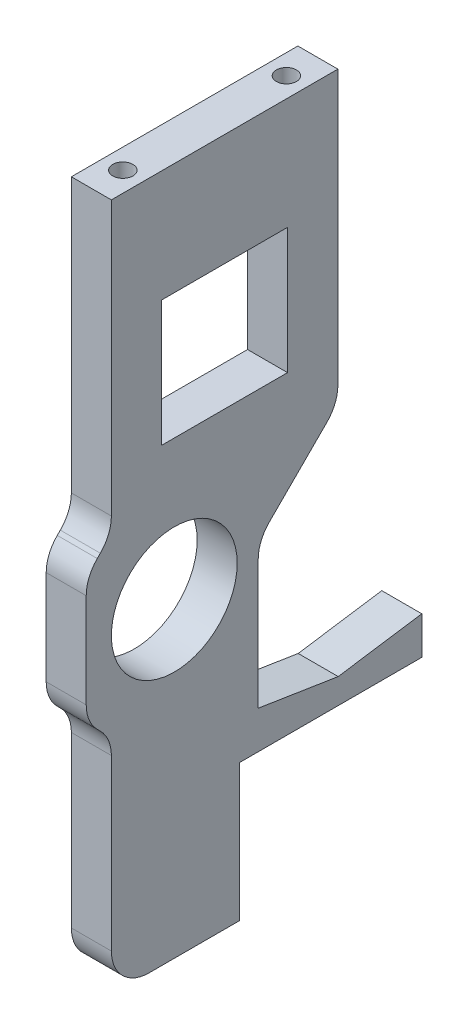
ISO-10303-21;
HEADER;
FILE_DESCRIPTION(('STEP AP214'),'2;1');
FILE_NAME('part.step','',(''),(''),'','','');
FILE_SCHEMA(('AUTOMOTIVE_DESIGN { 1 0 10303 214 1 1 1 1 }'));
ENDSEC;
DATA;
#1=APPLICATION_CONTEXT('core data for automotive mechanical design processes');
#2=APPLICATION_PROTOCOL_DEFINITION('international standard','automotive_design',2000,#1);
#3=PRODUCT_CONTEXT('',#1,'mechanical');
#4=PRODUCT('Part','Part','',(#3));
#5=PRODUCT_RELATED_PRODUCT_CATEGORY('part','',(#4));
#6=PRODUCT_DEFINITION_FORMATION('','',#4);
#7=PRODUCT_DEFINITION_CONTEXT('part definition',#1,'design');
#8=PRODUCT_DEFINITION('design','',#6,#7);
#9=PRODUCT_DEFINITION_SHAPE('','',#8);
#10=(LENGTH_UNIT() NAMED_UNIT(*) SI_UNIT(.MILLI.,.METRE.));
#11=(NAMED_UNIT(*) PLANE_ANGLE_UNIT() SI_UNIT($,.RADIAN.));
#12=(NAMED_UNIT(*) SI_UNIT($,.STERADIAN.) SOLID_ANGLE_UNIT());
#13=UNCERTAINTY_MEASURE_WITH_UNIT(LENGTH_MEASURE(1.E-05),#10,'distance_accuracy_value','');
#14=(GEOMETRIC_REPRESENTATION_CONTEXT(3) GLOBAL_UNCERTAINTY_ASSIGNED_CONTEXT((#13)) GLOBAL_UNIT_ASSIGNED_CONTEXT((#10,
#11,#12)) REPRESENTATION_CONTEXT('',''));
#15=CARTESIAN_POINT('',(0.,0.,0.));
#16=DIRECTION('',(0.,0.,1.));
#17=DIRECTION('',(1.,0.,0.));
#18=AXIS2_PLACEMENT_3D('',#15,#16,#17);
#19=CARTESIAN_POINT('',(3.18,-3.58642812516907,7.39959254020485));
#20=DIRECTION('',(0.,0.,-1.));
#21=DIRECTION('',(0.,1.,0.));
#22=AXIS2_PLACEMENT_3D('',#19,#20,#21);
#23=PLANE('',#22);
#24=DIRECTION('',(0.,1.,0.));
#25=VECTOR('',#24,1.);
#26=CARTESIAN_POINT('',(3.18,-3.58642812516907,7.39959254020485));
#27=LINE('',#26,#25);
#28=CARTESIAN_POINT('',(3.18,-2.34378743804977,7.39959254020485));
#29=VERTEX_POINT('',#28);
#30=CARTESIAN_POINT('',(3.18,19.4135718748309,7.39959254020485));
#31=VERTEX_POINT('',#30);
#32=EDGE_CURVE('E273',#29,#31,#27,.T.);
#33=ORIENTED_EDGE('',*,*,#32,.T.);
#34=DIRECTION('',(-1.,0.,0.));
#35=VECTOR('',#34,1.);
#36=CARTESIAN_POINT('',(3.18,19.4135718748309,7.39959254020485));
#37=LINE('',#36,#35);
#38=CARTESIAN_POINT('',(0.,19.4135718748309,7.39959254020485));
#39=VERTEX_POINT('',#38);
#40=EDGE_CURVE('E379',#31,#39,#37,.T.);
#41=ORIENTED_EDGE('',*,*,#40,.T.);
#42=DIRECTION('',(0.,1.,0.));
#43=VECTOR('',#42,1.);
#44=CARTESIAN_POINT('',(0.,-3.58642812516907,7.39959254020485));
#45=LINE('',#44,#43);
#46=CARTESIAN_POINT('',(0.,-2.34378743804977,7.39959254020485));
#47=VERTEX_POINT('',#46);
#48=EDGE_CURVE('E270',#47,#39,#45,.T.);
#49=ORIENTED_EDGE('',*,*,#48,.F.);
#50=DIRECTION('',(-1.,0.,0.));
#51=VECTOR('',#50,1.);
#52=CARTESIAN_POINT('',(0.,-2.34378743804977,7.39959254020485));
#53=LINE('',#52,#51);
#54=EDGE_CURVE('E433',#29,#47,#53,.T.);
#55=ORIENTED_EDGE('',*,*,#54,.F.);
#56=EDGE_LOOP('',(#33,#41,#49,#55));
#57=FACE_BOUND('',#56,.T.);
#58=ADVANCED_FACE('F36',(#57),#23,.F.);
#59=CARTESIAN_POINT('',(3.18,19.4135718748309,7.39959254020485));
#60=DIRECTION('',(0.,-1.,0.));
#61=DIRECTION('',(0.,0.,-1.));
#62=AXIS2_PLACEMENT_3D('',#59,#60,#61);
#63=PLANE('',#62);
#64=CARTESIAN_POINT('',(1.59,19.4135718748309,4.89959254020485));
#65=DIRECTION('',(0.,-1.,0.));
#66=DIRECTION('',(0.,0.,1.));
#67=AXIS2_PLACEMENT_3D('',#64,#65,#66);
#68=CIRCLE('',#67,0.8);
#69=CARTESIAN_POINT('',(1.59,19.4135718748309,5.69959254020485));
#70=VERTEX_POINT('',#69);
#71=EDGE_CURVE('E254',#70,#70,#68,.T.);
#72=ORIENTED_EDGE('',*,*,#71,.T.);
#73=EDGE_LOOP('',(#72));
#74=FACE_BOUND('',#73,.T.);
#75=CARTESIAN_POINT('',(1.59,19.4135718748309,-8.1004074597951));
#76=DIRECTION('',(0.,-1.,0.));
#77=DIRECTION('',(0.,0.,1.));
#78=AXIS2_PLACEMENT_3D('',#75,#76,#77);
#79=CIRCLE('',#78,0.8);
#80=CARTESIAN_POINT('',(1.59,19.4135718748309,-7.3004074597951));
#81=VERTEX_POINT('',#80);
#82=EDGE_CURVE('E260',#81,#81,#79,.T.);
#83=ORIENTED_EDGE('',*,*,#82,.T.);
#84=EDGE_LOOP('',(#83));
#85=FACE_BOUND('',#84,.T.);
#86=DIRECTION('',(0.,0.,-1.));
#87=VECTOR('',#86,1.);
#88=CARTESIAN_POINT('',(0.,19.4135718748309,7.39959254020485));
#89=LINE('',#88,#87);
#90=CARTESIAN_POINT('',(0.,19.4135718748309,-10.6004074597951));
#91=VERTEX_POINT('',#90);
#92=EDGE_CURVE('E320',#39,#91,#89,.T.);
#93=ORIENTED_EDGE('',*,*,#92,.F.);
#94=ORIENTED_EDGE('',*,*,#40,.F.);
#95=DIRECTION('',(0.,0.,-1.));
#96=VECTOR('',#95,1.);
#97=CARTESIAN_POINT('',(3.18,19.4135718748309,7.39959254020485));
#98=LINE('',#97,#96);
#99=CARTESIAN_POINT('',(3.18,19.4135718748309,-10.6004074597951));
#100=VERTEX_POINT('',#99);
#101=EDGE_CURVE('E276',#31,#100,#98,.T.);
#102=ORIENTED_EDGE('',*,*,#101,.T.);
#103=DIRECTION('',(-1.,0.,0.));
#104=VECTOR('',#103,1.);
#105=CARTESIAN_POINT('',(3.18,19.4135718748309,-10.6004074597951));
#106=LINE('',#105,#104);
#107=EDGE_CURVE('E376',#100,#91,#106,.T.);
#108=ORIENTED_EDGE('',*,*,#107,.T.);
#109=EDGE_LOOP('',(#93,#94,#102,#108));
#110=FACE_BOUND('',#109,.T.);
#111=ADVANCED_FACE('F520',(#74,#85,#110),#63,.F.);
#112=CARTESIAN_POINT('',(3.18,19.4135718748309,-10.6004074597951));
#113=DIRECTION('',(0.,0.,1.));
#114=DIRECTION('',(0.,-1.,0.));
#115=AXIS2_PLACEMENT_3D('',#112,#113,#114);
#116=PLANE('',#115);
#117=DIRECTION('',(0.,-1.,0.));
#118=VECTOR('',#117,1.);
#119=CARTESIAN_POINT('',(0.,19.4135718748309,-10.6004074597951));
#120=LINE('',#119,#118);
#121=CARTESIAN_POINT('',(0.,-2.34378743804976,-10.6004074597951));
#122=VERTEX_POINT('',#121);
#123=EDGE_CURVE('E323',#91,#122,#120,.T.);
#124=ORIENTED_EDGE('',*,*,#123,.F.);
#125=ORIENTED_EDGE('',*,*,#107,.F.);
#126=DIRECTION('',(0.,-1.,0.));
#127=VECTOR('',#126,1.);
#128=CARTESIAN_POINT('',(3.18,19.4135718748309,-10.6004074597951));
#129=LINE('',#128,#127);
#130=CARTESIAN_POINT('',(3.18,-2.34378743804976,-10.6004074597951));
#131=VERTEX_POINT('',#130);
#132=EDGE_CURVE('E280',#100,#131,#129,.T.);
#133=ORIENTED_EDGE('',*,*,#132,.T.);
#134=DIRECTION('',(-1.,0.,0.));
#135=VECTOR('',#134,1.);
#136=CARTESIAN_POINT('',(3.18,-2.34378743804976,-10.6004074597951));
#137=LINE('',#136,#135);
#138=EDGE_CURVE('E396',#122,#131,#137,.F.);
#139=ORIENTED_EDGE('',*,*,#138,.F.);
#140=EDGE_LOOP('',(#124,#125,#133,#139));
#141=FACE_BOUND('',#140,.T.);
#142=ADVANCED_FACE('F523',(#141),#116,.F.);
#143=CARTESIAN_POINT('',(3.18,-3.58642812516907,-10.6004074597951));
#144=DIRECTION('',(0.,0.707106781186556,0.707106781186539));
#145=DIRECTION('',(0.,-0.707106781186539,0.707106781186556));
#146=AXIS2_PLACEMENT_3D('',#143,#144,#145);
#147=PLANE('',#146);
#148=DIRECTION('',(0.,-0.707106781186539,0.707106781186556));
#149=VECTOR('',#148,1.);
#150=CARTESIAN_POINT('',(3.18,-3.58642812516907,-10.6004074597951));
#151=LINE('',#150,#149);
#152=CARTESIAN_POINT('',(3.18,-4.46510778160943,-9.72172780335472));
#153=VERTEX_POINT('',#152);
#154=CARTESIAN_POINT('',(3.18,-9.03774846872851,-5.14908711623553));
#155=VERTEX_POINT('',#154);
#156=EDGE_CURVE('E283',#153,#155,#151,.T.);
#157=ORIENTED_EDGE('',*,*,#156,.T.);
#158=DIRECTION('',(-1.,0.,0.));
#159=VECTOR('',#158,1.);
#160=CARTESIAN_POINT('',(3.18,-9.03774846872851,-5.14908711623553));
#161=LINE('',#160,#159);
#162=CARTESIAN_POINT('',(0.,-9.03774846872851,-5.14908711623553));
#163=VERTEX_POINT('',#162);
#164=EDGE_CURVE('E382',#163,#155,#161,.F.);
#165=ORIENTED_EDGE('',*,*,#164,.F.);
#166=DIRECTION('',(0.,-0.707106781186539,0.707106781186556));
#167=VECTOR('',#166,1.);
#168=CARTESIAN_POINT('',(0.,-3.58642812516907,-10.6004074597951));
#169=LINE('',#168,#167);
#170=CARTESIAN_POINT('',(0.,-4.46510778160943,-9.72172780335472));
#171=VERTEX_POINT('',#170);
#172=EDGE_CURVE('E326',#171,#163,#169,.T.);
#173=ORIENTED_EDGE('',*,*,#172,.F.);
#174=DIRECTION('',(-1.,0.,0.));
#175=VECTOR('',#174,1.);
#176=CARTESIAN_POINT('',(3.18,-4.46510778160943,-9.72172780335472));
#177=LINE('',#176,#175);
#178=EDGE_CURVE('E385',#153,#171,#177,.T.);
#179=ORIENTED_EDGE('',*,*,#178,.F.);
#180=EDGE_LOOP('',(#157,#165,#173,#179));
#181=FACE_BOUND('',#180,.T.);
#182=ADVANCED_FACE('F454',(#181),#147,.F.);
#183=CARTESIAN_POINT('',(3.18,-9.91642812516887,-4.27040745979515));
#184=DIRECTION('',(0.,0.,1.));
#185=DIRECTION('',(0.,-1.,0.));
#186=AXIS2_PLACEMENT_3D('',#183,#184,#185);
#187=PLANE('',#186);
#188=DIRECTION('',(0.,-1.,0.));
#189=VECTOR('',#188,1.);
#190=CARTESIAN_POINT('',(3.18,-9.91642812516887,-4.27040745979515));
#191=LINE('',#190,#189);
#192=CARTESIAN_POINT('',(3.18,-11.1590688122882,-4.27040745979515));
#193=VERTEX_POINT('',#192);
#194=CARTESIAN_POINT('',(3.18,-21.406428125169,-4.27040745979516));
#195=VERTEX_POINT('',#194);
#196=EDGE_CURVE('E286',#193,#195,#191,.T.);
#197=ORIENTED_EDGE('',*,*,#196,.T.);
#198=DIRECTION('',(-1.,0.,0.));
#199=VECTOR('',#198,1.);
#200=CARTESIAN_POINT('',(3.18,-21.406428125169,-4.27040745979516));
#201=LINE('',#200,#199);
#202=CARTESIAN_POINT('',(0.,-21.406428125169,-4.27040745979516));
#203=VERTEX_POINT('',#202);
#204=EDGE_CURVE('E373',#195,#203,#201,.T.);
#205=ORIENTED_EDGE('',*,*,#204,.T.);
#206=DIRECTION('',(0.,-1.,0.));
#207=VECTOR('',#206,1.);
#208=CARTESIAN_POINT('',(0.,-9.91642812516887,-4.27040745979515));
#209=LINE('',#208,#207);
#210=CARTESIAN_POINT('',(0.,-11.1590688122882,-4.27040745979515));
#211=VERTEX_POINT('',#210);
#212=EDGE_CURVE('E329',#211,#203,#209,.T.);
#213=ORIENTED_EDGE('',*,*,#212,.F.);
#214=DIRECTION('',(-1.,0.,0.));
#215=VECTOR('',#214,1.);
#216=CARTESIAN_POINT('',(0.,-11.1590688122882,-4.27040745979515));
#217=LINE('',#216,#215);
#218=EDGE_CURVE('E436',#193,#211,#217,.T.);
#219=ORIENTED_EDGE('',*,*,#218,.F.);
#220=EDGE_LOOP('',(#197,#205,#213,#219));
#221=FACE_BOUND('',#220,.T.);
#222=ADVANCED_FACE('F458',(#221),#187,.F.);
#223=CARTESIAN_POINT('',(3.18,-21.406428125169,-4.27040745979516));
#224=DIRECTION('',(0.,-0.987844405197016,0.15544591059579));
#225=DIRECTION('',(0.,-0.15544591059579,-0.987844405197016));
#226=AXIS2_PLACEMENT_3D('',#223,#224,#225);
#227=PLANE('',#226);
#228=DIRECTION('',(0.,-0.15544591059579,-0.987844405197016));
#229=VECTOR('',#228,1.);
#230=CARTESIAN_POINT('',(0.,-21.406428125169,-4.27040745979516));
#231=LINE('',#230,#229);
#232=CARTESIAN_POINT('',(0.,-22.406428125169,-10.6253151020151));
#233=VERTEX_POINT('',#232);
#234=EDGE_CURVE('E332',#203,#233,#231,.T.);
#235=ORIENTED_EDGE('',*,*,#234,.F.);
#236=ORIENTED_EDGE('',*,*,#204,.F.);
#237=DIRECTION('',(0.,-0.15544591059579,-0.987844405197016));
#238=VECTOR('',#237,1.);
#239=CARTESIAN_POINT('',(3.18,-21.406428125169,-4.27040745979516));
#240=LINE('',#239,#238);
#241=CARTESIAN_POINT('',(3.18,-22.406428125169,-10.6253151020151));
#242=VERTEX_POINT('',#241);
#243=EDGE_CURVE('E289',#195,#242,#240,.T.);
#244=ORIENTED_EDGE('',*,*,#243,.T.);
#245=DIRECTION('',(-1.,0.,0.));
#246=VECTOR('',#245,1.);
#247=CARTESIAN_POINT('',(3.18,-22.406428125169,-10.6253151020151));
#248=LINE('',#247,#246);
#249=EDGE_CURVE('E370',#242,#233,#248,.T.);
#250=ORIENTED_EDGE('',*,*,#249,.T.);
#251=EDGE_LOOP('',(#235,#236,#244,#250));
#252=FACE_BOUND('',#251,.T.);
#253=ADVANCED_FACE('F461',(#252),#227,.F.);
#254=CARTESIAN_POINT('',(3.18,-22.406428125169,-10.6253151020151));
#255=DIRECTION('',(0.,-0.988865593942495,-0.148811414605055));
#256=DIRECTION('',(0.,0.148811414605055,-0.988865593942495));
#257=AXIS2_PLACEMENT_3D('',#254,#255,#256);
#258=PLANE('',#257);
#259=DIRECTION('',(0.,0.148811414605055,-0.988865593942494));
#260=VECTOR('',#259,1.);
#261=CARTESIAN_POINT('',(0.,-22.406428125169,-10.6253151020151));
#262=LINE('',#261,#260);
#263=CARTESIAN_POINT('',(0.,-21.406428125169,-17.2704074597952));
#264=VERTEX_POINT('',#263);
#265=EDGE_CURVE('E335',#233,#264,#262,.T.);
#266=ORIENTED_EDGE('',*,*,#265,.F.);
#267=ORIENTED_EDGE('',*,*,#249,.F.);
#268=DIRECTION('',(0.,0.148811414605055,-0.988865593942494));
#269=VECTOR('',#268,1.);
#270=CARTESIAN_POINT('',(3.18,-22.406428125169,-10.6253151020151));
#271=LINE('',#270,#269);
#272=CARTESIAN_POINT('',(3.18,-21.406428125169,-17.2704074597952));
#273=VERTEX_POINT('',#272);
#274=EDGE_CURVE('E292',#242,#273,#271,.T.);
#275=ORIENTED_EDGE('',*,*,#274,.T.);
#276=DIRECTION('',(-1.,0.,0.));
#277=VECTOR('',#276,1.);
#278=CARTESIAN_POINT('',(3.18,-21.406428125169,-17.2704074597952));
#279=LINE('',#278,#277);
#280=EDGE_CURVE('E367',#273,#264,#279,.T.);
#281=ORIENTED_EDGE('',*,*,#280,.T.);
#282=EDGE_LOOP('',(#266,#267,#275,#281));
#283=FACE_BOUND('',#282,.T.);
#284=ADVANCED_FACE('F464',(#283),#258,.F.);
#285=CARTESIAN_POINT('',(3.18,-21.406428125169,-17.2704074597952));
#286=DIRECTION('',(0.,0.,1.));
#287=DIRECTION('',(-1.,0.,0.));
#288=AXIS2_PLACEMENT_3D('',#285,#286,#287);
#289=PLANE('',#288);
#290=DIRECTION('',(0.,-1.,0.));
#291=VECTOR('',#290,1.);
#292=CARTESIAN_POINT('',(0.,-21.406428125169,-17.2704074597952));
#293=LINE('',#292,#291);
#294=CARTESIAN_POINT('',(0.,-24.406428125169,-17.2704074597952));
#295=VERTEX_POINT('',#294);
#296=EDGE_CURVE('E338',#264,#295,#293,.T.);
#297=ORIENTED_EDGE('',*,*,#296,.F.);
#298=ORIENTED_EDGE('',*,*,#280,.F.);
#299=DIRECTION('',(0.,-1.,0.));
#300=VECTOR('',#299,1.);
#301=CARTESIAN_POINT('',(3.18,-21.406428125169,-17.2704074597952));
#302=LINE('',#301,#300);
#303=CARTESIAN_POINT('',(3.18,-24.406428125169,-17.2704074597952));
#304=VERTEX_POINT('',#303);
#305=EDGE_CURVE('E295',#273,#304,#302,.T.);
#306=ORIENTED_EDGE('',*,*,#305,.T.);
#307=DIRECTION('',(-1.,0.,0.));
#308=VECTOR('',#307,1.);
#309=CARTESIAN_POINT('',(3.18,-24.406428125169,-17.2704074597952));
#310=LINE('',#309,#308);
#311=EDGE_CURVE('E364',#304,#295,#310,.T.);
#312=ORIENTED_EDGE('',*,*,#311,.T.);
#313=EDGE_LOOP('',(#297,#298,#306,#312));
#314=FACE_BOUND('',#313,.T.);
#315=ADVANCED_FACE('F467',(#314),#289,.F.);
#316=CARTESIAN_POINT('',(3.18,-24.406428125169,-2.77040745979515));
#317=DIRECTION('',(0.,-1.,0.));
#318=DIRECTION('',(0.,0.,-1.));
#319=AXIS2_PLACEMENT_3D('',#316,#317,#318);
#320=PLANE('',#319);
#321=DIRECTION('',(0.,0.,-1.));
#322=VECTOR('',#321,1.);
#323=CARTESIAN_POINT('',(0.,-24.406428125169,-2.77040745979515));
#324=LINE('',#323,#322);
#325=CARTESIAN_POINT('',(0.,-24.406428125169,-2.77040745979515));
#326=VERTEX_POINT('',#325);
#327=EDGE_CURVE('E341',#326,#295,#324,.T.);
#328=ORIENTED_EDGE('',*,*,#327,.T.);
#329=ORIENTED_EDGE('',*,*,#311,.F.);
#330=DIRECTION('',(0.,0.,-1.));
#331=VECTOR('',#330,1.);
#332=CARTESIAN_POINT('',(3.18,-24.406428125169,-2.77040745979515));
#333=LINE('',#332,#331);
#334=CARTESIAN_POINT('',(3.18,-24.406428125169,-2.77040745979515));
#335=VERTEX_POINT('',#334);
#336=EDGE_CURVE('E298',#335,#304,#333,.T.);
#337=ORIENTED_EDGE('',*,*,#336,.F.);
#338=DIRECTION('',(-1.,0.,0.));
#339=VECTOR('',#338,1.);
#340=CARTESIAN_POINT('',(3.18,-24.406428125169,-2.77040745979515));
#341=LINE('',#340,#339);
#342=EDGE_CURVE('E361',#335,#326,#341,.T.);
#343=ORIENTED_EDGE('',*,*,#342,.T.);
#344=EDGE_LOOP('',(#328,#329,#337,#343));
#345=FACE_BOUND('',#344,.T.);
#346=ADVANCED_FACE('F472',(#345),#320,.T.);
#347=CARTESIAN_POINT('',(3.18,-35.286428125169,-2.77040745979516));
#348=DIRECTION('',(0.,0.,-1.));
#349=DIRECTION('',(0.,1.,0.));
#350=AXIS2_PLACEMENT_3D('',#347,#348,#349);
#351=PLANE('',#350);
#352=DIRECTION('',(0.,1.,0.));
#353=VECTOR('',#352,1.);
#354=CARTESIAN_POINT('',(0.,-35.286428125169,-2.77040745979516));
#355=LINE('',#354,#353);
#356=CARTESIAN_POINT('',(0.,-35.286428125169,-2.77040745979516));
#357=VERTEX_POINT('',#356);
#358=EDGE_CURVE('E343',#357,#326,#355,.T.);
#359=ORIENTED_EDGE('',*,*,#358,.T.);
#360=ORIENTED_EDGE('',*,*,#342,.F.);
#361=DIRECTION('',(0.,1.,0.));
#362=VECTOR('',#361,1.);
#363=CARTESIAN_POINT('',(3.18,-35.286428125169,-2.77040745979516));
#364=LINE('',#363,#362);
#365=CARTESIAN_POINT('',(3.18,-35.286428125169,-2.77040745979516));
#366=VERTEX_POINT('',#365);
#367=EDGE_CURVE('E300',#366,#335,#364,.T.);
#368=ORIENTED_EDGE('',*,*,#367,.F.);
#369=DIRECTION('',(-1.,0.,0.));
#370=VECTOR('',#369,1.);
#371=CARTESIAN_POINT('',(3.18,-35.286428125169,-2.77040745979516));
#372=LINE('',#371,#370);
#373=EDGE_CURVE('E317',#366,#357,#372,.T.);
#374=ORIENTED_EDGE('',*,*,#373,.T.);
#375=EDGE_LOOP('',(#359,#360,#368,#374));
#376=FACE_BOUND('',#375,.T.);
#377=ADVANCED_FACE('F477',(#376),#351,.T.);
#378=CARTESIAN_POINT('',(3.18,-35.286428125169,-2.77040745979516));
#379=DIRECTION('',(0.,1.,0.));
#380=DIRECTION('',(0.,0.,1.));
#381=AXIS2_PLACEMENT_3D('',#378,#379,#380);
#382=PLANE('',#381);
#383=DIRECTION('',(0.,0.,1.));
#384=VECTOR('',#383,1.);
#385=CARTESIAN_POINT('',(0.,-35.286428125169,-2.77040745979516));
#386=LINE('',#385,#384);
#387=CARTESIAN_POINT('',(0.,-35.286428125169,4.39959254020484));
#388=VERTEX_POINT('',#387);
#389=EDGE_CURVE('E345',#357,#388,#386,.T.);
#390=ORIENTED_EDGE('',*,*,#389,.F.);
#391=ORIENTED_EDGE('',*,*,#373,.F.);
#392=DIRECTION('',(0.,0.,1.));
#393=VECTOR('',#392,1.);
#394=CARTESIAN_POINT('',(3.18,-35.286428125169,-2.77040745979516));
#395=LINE('',#394,#393);
#396=CARTESIAN_POINT('',(3.18,-35.286428125169,4.39959254020484));
#397=VERTEX_POINT('',#396);
#398=EDGE_CURVE('E302',#366,#397,#395,.T.);
#399=ORIENTED_EDGE('',*,*,#398,.T.);
#400=DIRECTION('',(-1.,0.,0.));
#401=VECTOR('',#400,1.);
#402=CARTESIAN_POINT('',(3.18,-35.286428125169,4.39959254020484));
#403=LINE('',#402,#401);
#404=EDGE_CURVE('E413',#388,#397,#403,.F.);
#405=ORIENTED_EDGE('',*,*,#404,.F.);
#406=EDGE_LOOP('',(#390,#391,#399,#405));
#407=FACE_BOUND('',#406,.T.);
#408=ADVANCED_FACE('F480',(#407),#382,.F.);
#409=CARTESIAN_POINT('',(3.18,-17.586428125169,7.39959254020485));
#410=DIRECTION('',(0.,0.,1.));
#411=DIRECTION('',(0.,-1.,0.));
#412=AXIS2_PLACEMENT_3D('',#409,#410,#411);
#413=PLANE('',#412);
#414=DIRECTION('',(0.,-1.,0.));
#415=VECTOR('',#414,1.);
#416=CARTESIAN_POINT('',(3.18,-17.586428125169,7.39959254020485));
#417=LINE('',#416,#415);
#418=CARTESIAN_POINT('',(3.18,-18.8290688122883,7.39959254020485));
#419=VERTEX_POINT('',#418);
#420=CARTESIAN_POINT('',(3.18,-32.286428125169,7.39959254020484));
#421=VERTEX_POINT('',#420);
#422=EDGE_CURVE('E305',#419,#421,#417,.T.);
#423=ORIENTED_EDGE('',*,*,#422,.F.);
#424=DIRECTION('',(-1.,0.,0.));
#425=VECTOR('',#424,1.);
#426=CARTESIAN_POINT('',(3.18,-18.8290688122883,7.39959254020485));
#427=LINE('',#426,#425);
#428=CARTESIAN_POINT('',(0.,-18.8290688122883,7.39959254020485));
#429=VERTEX_POINT('',#428);
#430=EDGE_CURVE('E407',#429,#419,#427,.F.);
#431=ORIENTED_EDGE('',*,*,#430,.F.);
#432=DIRECTION('',(0.,-1.,0.));
#433=VECTOR('',#432,1.);
#434=CARTESIAN_POINT('',(0.,-17.586428125169,7.39959254020485));
#435=LINE('',#434,#433);
#436=CARTESIAN_POINT('',(0.,-32.286428125169,7.39959254020484));
#437=VERTEX_POINT('',#436);
#438=EDGE_CURVE('E348',#429,#437,#435,.T.);
#439=ORIENTED_EDGE('',*,*,#438,.T.);
#440=DIRECTION('',(-1.,0.,0.));
#441=VECTOR('',#440,1.);
#442=CARTESIAN_POINT('',(0.,-32.286428125169,7.39959254020484));
#443=LINE('',#442,#441);
#444=EDGE_CURVE('E410',#421,#437,#443,.T.);
#445=ORIENTED_EDGE('',*,*,#444,.F.);
#446=EDGE_LOOP('',(#423,#431,#439,#445));
#447=FACE_BOUND('',#446,.T.);
#448=ADVANCED_FACE('F489',(#447),#413,.T.);
#449=CARTESIAN_POINT('',(3.18,-15.586428125169,9.39959254020484));
#450=DIRECTION('',(0.,-0.707106781186556,0.707106781186539));
#451=DIRECTION('',(0.,-0.707106781186539,-0.707106781186556));
#452=AXIS2_PLACEMENT_3D('',#449,#450,#451);
#453=PLANE('',#452);
#454=DIRECTION('',(0.,-0.707106781186539,-0.707106781186556));
#455=VECTOR('',#454,1.);
#456=CARTESIAN_POINT('',(3.18,-15.586428125169,9.39959254020484));
#457=LINE('',#456,#455);
#458=CARTESIAN_POINT('',(3.18,-16.4651077816094,8.52091288376447));
#459=VERTEX_POINT('',#458);
#460=CARTESIAN_POINT('',(3.18,-16.7077484687286,8.27827219664523));
#461=VERTEX_POINT('',#460);
#462=EDGE_CURVE('E308',#459,#461,#457,.T.);
#463=ORIENTED_EDGE('',*,*,#462,.F.);
#464=DIRECTION('',(-1.,0.,0.));
#465=VECTOR('',#464,1.);
#466=CARTESIAN_POINT('',(3.18,-16.4651077816094,8.52091288376446));
#467=LINE('',#466,#465);
#468=CARTESIAN_POINT('',(0.,-16.4651077816094,8.52091288376447));
#469=VERTEX_POINT('',#468);
#470=EDGE_CURVE('E416',#469,#459,#467,.F.);
#471=ORIENTED_EDGE('',*,*,#470,.F.);
#472=DIRECTION('',(0.,-0.707106781186539,-0.707106781186556));
#473=VECTOR('',#472,1.);
#474=CARTESIAN_POINT('',(0.,-15.586428125169,9.39959254020484));
#475=LINE('',#474,#473);
#476=CARTESIAN_POINT('',(0.,-16.7077484687286,8.27827219664523));
#477=VERTEX_POINT('',#476);
#478=EDGE_CURVE('E351',#469,#477,#475,.T.);
#479=ORIENTED_EDGE('',*,*,#478,.T.);
#480=DIRECTION('',(-1.,0.,0.));
#481=VECTOR('',#480,1.);
#482=CARTESIAN_POINT('',(0.,-16.7077484687286,8.27827219664523));
#483=LINE('',#482,#481);
#484=EDGE_CURVE('E419',#461,#477,#483,.T.);
#485=ORIENTED_EDGE('',*,*,#484,.F.);
#486=EDGE_LOOP('',(#463,#471,#479,#485));
#487=FACE_BOUND('',#486,.T.);
#488=ADVANCED_FACE('F497',(#487),#453,.T.);
#489=CARTESIAN_POINT('',(3.18,-15.586428125169,9.39959254020484));
#490=DIRECTION('',(0.,0.,-1.));
#491=DIRECTION('',(1.,0.,0.));
#492=AXIS2_PLACEMENT_3D('',#489,#490,#491);
#493=PLANE('',#492);
#494=DIRECTION('',(0.,1.,0.));
#495=VECTOR('',#494,1.);
#496=CARTESIAN_POINT('',(3.18,-15.586428125169,9.39959254020484));
#497=LINE('',#496,#495);
#498=CARTESIAN_POINT('',(3.18,-14.3437874380497,9.39959254020484));
#499=VERTEX_POINT('',#498);
#500=CARTESIAN_POINT('',(3.18,-6.82906881228833,9.39959254020484));
#501=VERTEX_POINT('',#500);
#502=EDGE_CURVE('E311',#499,#501,#497,.T.);
#503=ORIENTED_EDGE('',*,*,#502,.T.);
#504=DIRECTION('',(-1.,0.,0.));
#505=VECTOR('',#504,1.);
#506=CARTESIAN_POINT('',(3.18,-6.82906881228833,9.39959254020484));
#507=LINE('',#506,#505);
#508=CARTESIAN_POINT('',(0.,-6.82906881228833,9.39959254020484));
#509=VERTEX_POINT('',#508);
#510=EDGE_CURVE('E422',#509,#501,#507,.F.);
#511=ORIENTED_EDGE('',*,*,#510,.F.);
#512=DIRECTION('',(0.,1.,0.));
#513=VECTOR('',#512,1.);
#514=CARTESIAN_POINT('',(0.,-15.586428125169,9.39959254020484));
#515=LINE('',#514,#513);
#516=CARTESIAN_POINT('',(0.,-14.3437874380497,9.39959254020484));
#517=VERTEX_POINT('',#516);
#518=EDGE_CURVE('E354',#517,#509,#515,.T.);
#519=ORIENTED_EDGE('',*,*,#518,.F.);
#520=DIRECTION('',(-1.,0.,0.));
#521=VECTOR('',#520,1.);
#522=CARTESIAN_POINT('',(0.,-14.3437874380497,9.39959254020484));
#523=LINE('',#522,#521);
#524=EDGE_CURVE('E425',#499,#517,#523,.T.);
#525=ORIENTED_EDGE('',*,*,#524,.F.);
#526=EDGE_LOOP('',(#503,#511,#519,#525));
#527=FACE_BOUND('',#526,.T.);
#528=ADVANCED_FACE('F505',(#527),#493,.F.);
#529=CARTESIAN_POINT('',(3.18,-5.58642812516902,9.39959254020484));
#530=DIRECTION('',(0.,-0.707106781186555,-0.70710678118654));
#531=DIRECTION('',(0.,0.70710678118654,-0.707106781186555));
#532=AXIS2_PLACEMENT_3D('',#529,#530,#531);
#533=PLANE('',#532);
#534=DIRECTION('',(0.,0.70710678118654,-0.707106781186555));
#535=VECTOR('',#534,1.);
#536=CARTESIAN_POINT('',(3.18,-5.58642812516902,9.39959254020484));
#537=LINE('',#536,#535);
#538=CARTESIAN_POINT('',(3.18,-4.70774846872866,8.52091288376447));
#539=VERTEX_POINT('',#538);
#540=CARTESIAN_POINT('',(3.18,-4.46510778160943,8.27827219664523));
#541=VERTEX_POINT('',#540);
#542=EDGE_CURVE('E314',#539,#541,#537,.T.);
#543=ORIENTED_EDGE('',*,*,#542,.T.);
#544=DIRECTION('',(-1.,0.,0.));
#545=VECTOR('',#544,1.);
#546=CARTESIAN_POINT('',(3.18,-4.46510778160943,8.27827219664523));
#547=LINE('',#546,#545);
#548=CARTESIAN_POINT('',(0.,-4.46510778160943,8.27827219664523));
#549=VERTEX_POINT('',#548);
#550=EDGE_CURVE('E428',#549,#541,#547,.F.);
#551=ORIENTED_EDGE('',*,*,#550,.F.);
#552=DIRECTION('',(0.,0.70710678118654,-0.707106781186555));
#553=VECTOR('',#552,1.);
#554=CARTESIAN_POINT('',(0.,-5.58642812516902,9.39959254020484));
#555=LINE('',#554,#553);
#556=CARTESIAN_POINT('',(0.,-4.70774846872866,8.52091288376447));
#557=VERTEX_POINT('',#556);
#558=EDGE_CURVE('E277',#557,#549,#555,.T.);
#559=ORIENTED_EDGE('',*,*,#558,.F.);
#560=DIRECTION('',(-1.,0.,0.));
#561=VECTOR('',#560,1.);
#562=CARTESIAN_POINT('',(3.18,-4.70774846872866,8.52091288376447));
#563=LINE('',#562,#561);
#564=EDGE_CURVE('E430',#539,#557,#563,.T.);
#565=ORIENTED_EDGE('',*,*,#564,.F.);
#566=EDGE_LOOP('',(#543,#551,#559,#565));
#567=FACE_BOUND('',#566,.T.);
#568=ADVANCED_FACE('F512',(#567),#533,.F.);
#569=CARTESIAN_POINT('',(3.18,0.,0.));
#570=DIRECTION('',(1.,0.,0.));
#571=DIRECTION('',(0.,0.,1.));
#572=AXIS2_PLACEMENT_3D('',#569,#570,#571);
#573=PLANE('',#572);
#574=DIRECTION('',(0.,0.,-1.));
#575=VECTOR('',#574,1.);
#576=CARTESIAN_POINT('',(3.18,0.524437773348046,-6.6004074597951));
#577=LINE('',#576,#575);
#578=CARTESIAN_POINT('',(3.18,0.524437773348046,3.39959254020491));
#579=VERTEX_POINT('',#578);
#580=CARTESIAN_POINT('',(3.18,0.524437773348046,-6.6004074597951));
#581=VERTEX_POINT('',#580);
#582=EDGE_CURVE('E233',#579,#581,#577,.T.);
#583=ORIENTED_EDGE('',*,*,#582,.F.);
#584=DIRECTION('',(0.,-1.,0.));
#585=VECTOR('',#584,1.);
#586=CARTESIAN_POINT('',(3.18,10.5244377733481,3.39959254020491));
#587=LINE('',#586,#585);
#588=CARTESIAN_POINT('',(3.18,10.5244377733481,3.39959254020491));
#589=VERTEX_POINT('',#588);
#590=EDGE_CURVE('E238',#589,#579,#587,.T.);
#591=ORIENTED_EDGE('',*,*,#590,.F.);
#592=DIRECTION('',(0.,0.,1.));
#593=VECTOR('',#592,1.);
#594=CARTESIAN_POINT('',(3.18,10.5244377733481,-6.6004074597951));
#595=LINE('',#594,#593);
#596=CARTESIAN_POINT('',(3.18,10.5244377733481,-6.6004074597951));
#597=VERTEX_POINT('',#596);
#598=EDGE_CURVE('E226',#597,#589,#595,.T.);
#599=ORIENTED_EDGE('',*,*,#598,.F.);
#600=DIRECTION('',(0.,1.,0.));
#601=VECTOR('',#600,1.);
#602=CARTESIAN_POINT('',(3.18,10.5244377733481,-6.6004074597951));
#603=LINE('',#602,#601);
#604=EDGE_CURVE('E216',#581,#597,#603,.T.);
#605=ORIENTED_EDGE('',*,*,#604,.F.);
#606=EDGE_LOOP('',(#583,#591,#599,#605));
#607=FACE_BOUND('',#606,.T.);
#608=CARTESIAN_POINT('',(3.18,-10.586428125169,2.39959254020484));
#609=DIRECTION('',(1.,0.,0.));
#610=DIRECTION('',(0.,0.,-1.));
#611=AXIS2_PLACEMENT_3D('',#608,#609,#610);
#612=CIRCLE('',#611,5.);
#613=CARTESIAN_POINT('',(3.18,-10.586428125169,-2.60040745979516));
#614=VERTEX_POINT('',#613);
#615=EDGE_CURVE('E267',#614,#614,#612,.T.);
#616=ORIENTED_EDGE('',*,*,#615,.F.);
#617=EDGE_LOOP('',(#616));
#618=FACE_BOUND('',#617,.T.);
#619=ORIENTED_EDGE('',*,*,#132,.F.);
#620=ORIENTED_EDGE('',*,*,#101,.F.);
#621=ORIENTED_EDGE('',*,*,#32,.F.);
#622=CARTESIAN_POINT('',(3.18,-2.34378743804977,10.3995925402048));
#623=DIRECTION('',(-1.,0.,0.));
#624=DIRECTION('',(0.,0.,1.));
#625=AXIS2_PLACEMENT_3D('',#622,#623,#624);
#626=CIRCLE('',#625,3.);
#627=EDGE_CURVE('E59',#541,#29,#626,.F.);
#628=ORIENTED_EDGE('',*,*,#627,.F.);
#629=ORIENTED_EDGE('',*,*,#542,.F.);
#630=CARTESIAN_POINT('',(3.18,-6.82906881228833,6.39959254020485));
#631=DIRECTION('',(-1.,0.,0.));
#632=DIRECTION('',(0.,0.,1.));
#633=AXIS2_PLACEMENT_3D('',#630,#631,#632);
#634=CIRCLE('',#633,3.);
#635=EDGE_CURVE('E399',#501,#539,#634,.T.);
#636=ORIENTED_EDGE('',*,*,#635,.F.);
#637=ORIENTED_EDGE('',*,*,#502,.F.);
#638=CARTESIAN_POINT('',(3.18,-14.3437874380497,6.39959254020485));
#639=DIRECTION('',(-1.,0.,0.));
#640=DIRECTION('',(0.,0.,1.));
#641=AXIS2_PLACEMENT_3D('',#638,#639,#640);
#642=CIRCLE('',#641,3.);
#643=EDGE_CURVE('E401',#459,#499,#642,.T.);
#644=ORIENTED_EDGE('',*,*,#643,.F.);
#645=ORIENTED_EDGE('',*,*,#462,.T.);
#646=CARTESIAN_POINT('',(3.18,-18.8290688122883,10.3995925402048));
#647=DIRECTION('',(-1.,0.,0.));
#648=DIRECTION('',(0.,0.,1.));
#649=AXIS2_PLACEMENT_3D('',#646,#647,#648);
#650=CIRCLE('',#649,3.);
#651=EDGE_CURVE('E441',#419,#461,#650,.F.);
#652=ORIENTED_EDGE('',*,*,#651,.F.);
#653=ORIENTED_EDGE('',*,*,#422,.T.);
#654=CARTESIAN_POINT('',(3.18,-32.286428125169,4.39959254020484));
#655=DIRECTION('',(-1.,0.,0.));
#656=DIRECTION('',(0.,0.,1.));
#657=AXIS2_PLACEMENT_3D('',#654,#655,#656);
#658=CIRCLE('',#657,3.);
#659=EDGE_CURVE('E403',#397,#421,#658,.T.);
#660=ORIENTED_EDGE('',*,*,#659,.F.);
#661=ORIENTED_EDGE('',*,*,#398,.F.);
#662=ORIENTED_EDGE('',*,*,#367,.T.);
#663=ORIENTED_EDGE('',*,*,#336,.T.);
#664=ORIENTED_EDGE('',*,*,#305,.F.);
#665=ORIENTED_EDGE('',*,*,#274,.F.);
#666=ORIENTED_EDGE('',*,*,#243,.F.);
#667=ORIENTED_EDGE('',*,*,#196,.F.);
#668=CARTESIAN_POINT('',(3.18,-11.1590688122882,-7.27040745979515));
#669=DIRECTION('',(-1.,0.,0.));
#670=DIRECTION('',(0.,0.,1.));
#671=AXIS2_PLACEMENT_3D('',#668,#669,#670);
#672=CIRCLE('',#671,3.);
#673=EDGE_CURVE('E12',#155,#193,#672,.F.);
#674=ORIENTED_EDGE('',*,*,#673,.F.);
#675=ORIENTED_EDGE('',*,*,#156,.F.);
#676=CARTESIAN_POINT('',(3.18,-2.34378743804976,-7.6004074597951));
#677=DIRECTION('',(-1.,0.,0.));
#678=DIRECTION('',(0.,0.,1.));
#679=AXIS2_PLACEMENT_3D('',#676,#677,#678);
#680=CIRCLE('',#679,3.);
#681=EDGE_CURVE('E405',#131,#153,#680,.T.);
#682=ORIENTED_EDGE('',*,*,#681,.F.);
#683=EDGE_LOOP('',(#619,#620,#621,#628,#629,#636,#637,#644,#645,#652,#653,#660,#661,#662,#663,
#664,#665,#666,#667,#674,#675,#682));
#684=FACE_BOUND('',#683,.T.);
#685=ADVANCED_FACE('F235',(#607,#618,#684),#573,.T.);
#686=CARTESIAN_POINT('',(0.,0.,0.));
#687=DIRECTION('',(1.,0.,0.));
#688=DIRECTION('',(0.,0.,1.));
#689=AXIS2_PLACEMENT_3D('',#686,#687,#688);
#690=PLANE('',#689);
#691=CARTESIAN_POINT('',(0.,-10.586428125169,2.39959254020484));
#692=DIRECTION('',(1.,0.,0.));
#693=DIRECTION('',(0.,0.,-1.));
#694=AXIS2_PLACEMENT_3D('',#691,#692,#693);
#695=CIRCLE('',#694,5.);
#696=CARTESIAN_POINT('',(0.,-10.586428125169,-2.60040745979516));
#697=VERTEX_POINT('',#696);
#698=EDGE_CURVE('E266',#697,#697,#695,.T.);
#699=ORIENTED_EDGE('',*,*,#698,.T.);
#700=EDGE_LOOP('',(#699));
#701=FACE_BOUND('',#700,.T.);
#702=DIRECTION('',(0.,-1.,0.));
#703=VECTOR('',#702,1.);
#704=CARTESIAN_POINT('',(0.,0.,3.39959254020491));
#705=LINE('',#704,#703);
#706=CARTESIAN_POINT('',(0.,10.5244377733481,3.39959254020491));
#707=VERTEX_POINT('',#706);
#708=CARTESIAN_POINT('',(0.,0.524437773348046,3.39959254020491));
#709=VERTEX_POINT('',#708);
#710=EDGE_CURVE('E248',#707,#709,#705,.T.);
#711=ORIENTED_EDGE('',*,*,#710,.T.);
#712=DIRECTION('',(0.,0.,-1.));
#713=VECTOR('',#712,1.);
#714=CARTESIAN_POINT('',(0.,0.524437773348046,0.));
#715=LINE('',#714,#713);
#716=CARTESIAN_POINT('',(0.,0.524437773348046,-6.6004074597951));
#717=VERTEX_POINT('',#716);
#718=EDGE_CURVE('E250',#709,#717,#715,.T.);
#719=ORIENTED_EDGE('',*,*,#718,.T.);
#720=DIRECTION('',(0.,1.,0.));
#721=VECTOR('',#720,1.);
#722=CARTESIAN_POINT('',(0.,0.,-6.6004074597951));
#723=LINE('',#722,#721);
#724=CARTESIAN_POINT('',(0.,10.5244377733481,-6.6004074597951));
#725=VERTEX_POINT('',#724);
#726=EDGE_CURVE('E252',#717,#725,#723,.T.);
#727=ORIENTED_EDGE('',*,*,#726,.T.);
#728=DIRECTION('',(0.,0.,1.));
#729=VECTOR('',#728,1.);
#730=CARTESIAN_POINT('',(0.,10.5244377733481,0.));
#731=LINE('',#730,#729);
#732=EDGE_CURVE('E51',#725,#707,#731,.T.);
#733=ORIENTED_EDGE('',*,*,#732,.T.);
#734=EDGE_LOOP('',(#711,#719,#727,#733));
#735=FACE_BOUND('',#734,.T.);
#736=ORIENTED_EDGE('',*,*,#172,.T.);
#737=CARTESIAN_POINT('',(0.,-11.1590688122882,-7.27040745979515));
#738=DIRECTION('',(-1.,0.,0.));
#739=DIRECTION('',(0.,0.,1.));
#740=AXIS2_PLACEMENT_3D('',#737,#738,#739);
#741=CIRCLE('',#740,3.);
#742=EDGE_CURVE('E44',#211,#163,#741,.T.);
#743=ORIENTED_EDGE('',*,*,#742,.F.);
#744=ORIENTED_EDGE('',*,*,#212,.T.);
#745=ORIENTED_EDGE('',*,*,#234,.T.);
#746=ORIENTED_EDGE('',*,*,#265,.T.);
#747=ORIENTED_EDGE('',*,*,#296,.T.);
#748=ORIENTED_EDGE('',*,*,#327,.F.);
#749=ORIENTED_EDGE('',*,*,#358,.F.);
#750=ORIENTED_EDGE('',*,*,#389,.T.);
#751=CARTESIAN_POINT('',(0.,-32.286428125169,4.39959254020484));
#752=DIRECTION('',(-1.,0.,0.));
#753=DIRECTION('',(0.,0.,1.));
#754=AXIS2_PLACEMENT_3D('',#751,#752,#753);
#755=CIRCLE('',#754,3.);
#756=EDGE_CURVE('E392',#437,#388,#755,.F.);
#757=ORIENTED_EDGE('',*,*,#756,.F.);
#758=ORIENTED_EDGE('',*,*,#438,.F.);
#759=CARTESIAN_POINT('',(0.,-18.8290688122883,10.3995925402048));
#760=DIRECTION('',(-1.,0.,0.));
#761=DIRECTION('',(0.,0.,1.));
#762=AXIS2_PLACEMENT_3D('',#759,#760,#761);
#763=CIRCLE('',#762,3.);
#764=EDGE_CURVE('E439',#477,#429,#763,.T.);
#765=ORIENTED_EDGE('',*,*,#764,.F.);
#766=ORIENTED_EDGE('',*,*,#478,.F.);
#767=CARTESIAN_POINT('',(0.,-14.3437874380497,6.39959254020485));
#768=DIRECTION('',(-1.,0.,0.));
#769=DIRECTION('',(0.,0.,1.));
#770=AXIS2_PLACEMENT_3D('',#767,#768,#769);
#771=CIRCLE('',#770,3.);
#772=EDGE_CURVE('E390',#517,#469,#771,.F.);
#773=ORIENTED_EDGE('',*,*,#772,.F.);
#774=ORIENTED_EDGE('',*,*,#518,.T.);
#775=CARTESIAN_POINT('',(0.,-6.82906881228833,6.39959254020485));
#776=DIRECTION('',(-1.,0.,0.));
#777=DIRECTION('',(0.,0.,1.));
#778=AXIS2_PLACEMENT_3D('',#775,#776,#777);
#779=CIRCLE('',#778,3.);
#780=EDGE_CURVE('E388',#557,#509,#779,.F.);
#781=ORIENTED_EDGE('',*,*,#780,.F.);
#782=ORIENTED_EDGE('',*,*,#558,.T.);
#783=CARTESIAN_POINT('',(0.,-2.34378743804977,10.3995925402048));
#784=DIRECTION('',(-1.,0.,0.));
#785=DIRECTION('',(0.,0.,1.));
#786=AXIS2_PLACEMENT_3D('',#783,#784,#785);
#787=CIRCLE('',#786,3.);
#788=EDGE_CURVE('E443',#47,#549,#787,.T.);
#789=ORIENTED_EDGE('',*,*,#788,.F.);
#790=ORIENTED_EDGE('',*,*,#48,.T.);
#791=ORIENTED_EDGE('',*,*,#92,.T.);
#792=ORIENTED_EDGE('',*,*,#123,.T.);
#793=CARTESIAN_POINT('',(0.,-2.34378743804976,-7.6004074597951));
#794=DIRECTION('',(-1.,0.,0.));
#795=DIRECTION('',(0.,0.,1.));
#796=AXIS2_PLACEMENT_3D('',#793,#794,#795);
#797=CIRCLE('',#796,3.);
#798=EDGE_CURVE('E394',#171,#122,#797,.F.);
#799=ORIENTED_EDGE('',*,*,#798,.F.);
#800=EDGE_LOOP('',(#736,#743,#744,#745,#746,#747,#748,#749,#750,#757,#758,#765,#766,#773,#774,
#781,#782,#789,#790,#791,#792,#799));
#801=FACE_BOUND('',#800,.T.);
#802=ADVANCED_FACE('F451',(#701,#735,#801),#690,.F.);
#803=CARTESIAN_POINT('',(3.18,-10.586428125169,2.39959254020484));
#804=DIRECTION('',(-1.,0.,0.));
#805=DIRECTION('',(0.,0.,-1.));
#806=AXIS2_PLACEMENT_3D('',#803,#804,#805);
#807=CYLINDRICAL_SURFACE('',#806,5.);
#808=CARTESIAN_POINT('',(3.18,-10.586428125169,-2.60040745979516));
#809=CARTESIAN_POINT('',(3.146875,-10.586428125169,-2.60040745979516));
#810=CARTESIAN_POINT('',(3.11375,-10.586428125169,-2.60040745979516));
#811=CARTESIAN_POINT('',(3.0475,-10.586428125169,-2.60040745979516));
#812=CARTESIAN_POINT('',(3.014375,-10.586428125169,-2.60040745979516));
#813=CARTESIAN_POINT('',(2.948125,-10.586428125169,-2.60040745979516));
#814=CARTESIAN_POINT('',(2.915,-10.586428125169,-2.60040745979516));
#815=CARTESIAN_POINT('',(2.84875,-10.586428125169,-2.60040745979516));
#816=CARTESIAN_POINT('',(2.815625,-10.586428125169,-2.60040745979516));
#817=CARTESIAN_POINT('',(2.749375,-10.586428125169,-2.60040745979516));
#818=CARTESIAN_POINT('',(2.71625,-10.586428125169,-2.60040745979516));
#819=CARTESIAN_POINT('',(2.65,-10.586428125169,-2.60040745979516));
#820=CARTESIAN_POINT('',(2.616875,-10.586428125169,-2.60040745979516));
#821=CARTESIAN_POINT('',(2.550625,-10.586428125169,-2.60040745979516));
#822=CARTESIAN_POINT('',(2.5175,-10.586428125169,-2.60040745979516));
#823=CARTESIAN_POINT('',(2.45125,-10.586428125169,-2.60040745979516));
#824=CARTESIAN_POINT('',(2.418125,-10.586428125169,-2.60040745979516));
#825=CARTESIAN_POINT('',(2.351875,-10.586428125169,-2.60040745979516));
#826=CARTESIAN_POINT('',(2.31875,-10.586428125169,-2.60040745979516));
#827=CARTESIAN_POINT('',(2.2525,-10.586428125169,-2.60040745979516));
#828=CARTESIAN_POINT('',(2.219375,-10.586428125169,-2.60040745979516));
#829=CARTESIAN_POINT('',(2.153125,-10.586428125169,-2.60040745979516));
#830=CARTESIAN_POINT('',(2.12,-10.586428125169,-2.60040745979516));
#831=CARTESIAN_POINT('',(2.05375,-10.586428125169,-2.60040745979516));
#832=CARTESIAN_POINT('',(2.020625,-10.586428125169,-2.60040745979516));
#833=CARTESIAN_POINT('',(1.954375,-10.586428125169,-2.60040745979516));
#834=CARTESIAN_POINT('',(1.92125,-10.586428125169,-2.60040745979516));
#835=CARTESIAN_POINT('',(1.855,-10.586428125169,-2.60040745979516));
#836=CARTESIAN_POINT('',(1.821875,-10.586428125169,-2.60040745979516));
#837=CARTESIAN_POINT('',(1.755625,-10.586428125169,-2.60040745979516));
#838=CARTESIAN_POINT('',(1.7225,-10.586428125169,-2.60040745979516));
#839=CARTESIAN_POINT('',(1.65625,-10.586428125169,-2.60040745979516));
#840=CARTESIAN_POINT('',(1.623125,-10.586428125169,-2.60040745979516));
#841=CARTESIAN_POINT('',(1.556875,-10.586428125169,-2.60040745979516));
#842=CARTESIAN_POINT('',(1.52375,-10.586428125169,-2.60040745979516));
#843=CARTESIAN_POINT('',(1.4575,-10.586428125169,-2.60040745979516));
#844=CARTESIAN_POINT('',(1.424375,-10.586428125169,-2.60040745979516));
#845=CARTESIAN_POINT('',(1.358125,-10.586428125169,-2.60040745979516));
#846=CARTESIAN_POINT('',(1.325,-10.586428125169,-2.60040745979516));
#847=CARTESIAN_POINT('',(1.25875,-10.586428125169,-2.60040745979516));
#848=CARTESIAN_POINT('',(1.225625,-10.586428125169,-2.60040745979516));
#849=CARTESIAN_POINT('',(1.159375,-10.586428125169,-2.60040745979516));
#850=CARTESIAN_POINT('',(1.12625,-10.586428125169,-2.60040745979516));
#851=CARTESIAN_POINT('',(1.06,-10.586428125169,-2.60040745979516));
#852=CARTESIAN_POINT('',(1.026875,-10.586428125169,-2.60040745979516));
#853=CARTESIAN_POINT('',(0.960625,-10.586428125169,-2.60040745979516));
#854=CARTESIAN_POINT('',(0.9275,-10.586428125169,-2.60040745979516));
#855=CARTESIAN_POINT('',(0.86125,-10.586428125169,-2.60040745979516));
#856=CARTESIAN_POINT('',(0.828125,-10.586428125169,-2.60040745979516));
#857=CARTESIAN_POINT('',(0.761875,-10.586428125169,-2.60040745979516));
#858=CARTESIAN_POINT('',(0.72875,-10.586428125169,-2.60040745979516));
#859=CARTESIAN_POINT('',(0.6625,-10.586428125169,-2.60040745979516));
#860=CARTESIAN_POINT('',(0.629375,-10.586428125169,-2.60040745979516));
#861=CARTESIAN_POINT('',(0.563125,-10.586428125169,-2.60040745979516));
#862=CARTESIAN_POINT('',(0.53,-10.586428125169,-2.60040745979516));
#863=CARTESIAN_POINT('',(0.46375,-10.586428125169,-2.60040745979516));
#864=CARTESIAN_POINT('',(0.430625,-10.586428125169,-2.60040745979516));
#865=CARTESIAN_POINT('',(0.364375,-10.586428125169,-2.60040745979516));
#866=CARTESIAN_POINT('',(0.33125,-10.586428125169,-2.60040745979516));
#867=CARTESIAN_POINT('',(0.265,-10.586428125169,-2.60040745979516));
#868=CARTESIAN_POINT('',(0.231875,-10.586428125169,-2.60040745979516));
#869=CARTESIAN_POINT('',(0.165625,-10.586428125169,-2.60040745979516));
#870=CARTESIAN_POINT('',(0.1325,-10.586428125169,-2.60040745979516));
#871=CARTESIAN_POINT('',(0.06625,-10.586428125169,-2.60040745979516));
#872=CARTESIAN_POINT('',(0.033125,-10.586428125169,-2.60040745979516));
#873=CARTESIAN_POINT('',(0.,-10.586428125169,-2.60040745979516));
#874=B_SPLINE_CURVE_WITH_KNOTS('',3,(#808,#809,#810,#811,#812,#813,#814,#815,#816,#817,#818,
#819,#820,#821,#822,#823,#824,#825,#826,#827,#828,#829,#830,#831,#832,#833,#834,#835,#836,#837,
#838,#839,#840,#841,#842,#843,#844,#845,#846,#847,#848,#849,#850,#851,#852,#853,#854,#855,#856,
#857,#858,#859,#860,#861,#862,#863,#864,#865,#866,#867,#868,#869,#870,#871,#872,#873),
.UNSPECIFIED.,.F.,.F.,(4,2,2,2,2,2,2,2,2,2,2,2,2,2,2,2,2,2,2,2,2,2,2,2,2,2,2,2,2,2,2,2,4),(0.,
0.0993750000000001,0.19875,0.298125,0.3975,0.496875,0.59625,0.695625,0.795,0.894375,0.99375,
1.093125,1.1925,1.291875,1.39125,1.490625,1.59,1.689375,1.78875,1.888125,1.9875,2.086875,
2.18625,2.285625,2.385,2.484375,2.58375,2.683125,2.7825,2.881875,2.98125,3.080625,3.18),.UNSPECIFIED.);
#875=EDGE_CURVE('BSEAM528',#614,#697,#874,.T.);
#876=ORIENTED_EDGE('',*,*,#615,.T.);
#877=ORIENTED_EDGE('',*,*,#698,.F.);
#878=ORIENTED_EDGE('',*,*,#875,.T.);
#879=ORIENTED_EDGE('',*,*,#875,.F.);
#880=EDGE_LOOP('',(#876,#878,#877,#879));
#881=FACE_BOUND('',#880,.T.);
#882=ADVANCED_FACE('F528',(#881),#807,.F.);
#883=CARTESIAN_POINT('',(3.18,-2.34378743804976,-7.6004074597951));
#884=DIRECTION('',(-1.,0.,0.));
#885=DIRECTION('',(0.,0.,-1.));
#886=AXIS2_PLACEMENT_3D('',#883,#884,#885);
#887=CYLINDRICAL_SURFACE('',#886,3.);
#888=ORIENTED_EDGE('',*,*,#681,.T.);
#889=ORIENTED_EDGE('',*,*,#178,.T.);
#890=ORIENTED_EDGE('',*,*,#798,.T.);
#891=ORIENTED_EDGE('',*,*,#138,.T.);
#892=EDGE_LOOP('',(#888,#889,#890,#891));
#893=FACE_BOUND('',#892,.T.);
#894=ADVANCED_FACE('F526',(#893),#887,.T.);
#895=CARTESIAN_POINT('',(3.18,-32.286428125169,4.39959254020484));
#896=DIRECTION('',(1.,0.,0.));
#897=DIRECTION('',(0.,0.,1.));
#898=AXIS2_PLACEMENT_3D('',#895,#896,#897);
#899=CYLINDRICAL_SURFACE('',#898,3.);
#900=ORIENTED_EDGE('',*,*,#659,.T.);
#901=ORIENTED_EDGE('',*,*,#444,.T.);
#902=ORIENTED_EDGE('',*,*,#756,.T.);
#903=ORIENTED_EDGE('',*,*,#404,.T.);
#904=EDGE_LOOP('',(#900,#901,#902,#903));
#905=FACE_BOUND('',#904,.T.);
#906=ADVANCED_FACE('F486',(#905),#899,.T.);
#907=CARTESIAN_POINT('',(3.18,-18.8290688122883,10.3995925402048));
#908=DIRECTION('',(1.,0.,0.));
#909=DIRECTION('',(0.,0.,1.));
#910=AXIS2_PLACEMENT_3D('',#907,#908,#909);
#911=CYLINDRICAL_SURFACE('',#910,3.);
#912=ORIENTED_EDGE('',*,*,#651,.T.);
#913=ORIENTED_EDGE('',*,*,#484,.T.);
#914=ORIENTED_EDGE('',*,*,#764,.T.);
#915=ORIENTED_EDGE('',*,*,#430,.T.);
#916=EDGE_LOOP('',(#912,#913,#914,#915));
#917=FACE_BOUND('',#916,.T.);
#918=ADVANCED_FACE('F491',(#917),#911,.F.);
#919=CARTESIAN_POINT('',(3.18,-14.3437874380497,6.39959254020485));
#920=DIRECTION('',(1.,0.,0.));
#921=DIRECTION('',(0.,0.,1.));
#922=AXIS2_PLACEMENT_3D('',#919,#920,#921);
#923=CYLINDRICAL_SURFACE('',#922,3.);
#924=ORIENTED_EDGE('',*,*,#643,.T.);
#925=ORIENTED_EDGE('',*,*,#524,.T.);
#926=ORIENTED_EDGE('',*,*,#772,.T.);
#927=ORIENTED_EDGE('',*,*,#470,.T.);
#928=EDGE_LOOP('',(#924,#925,#926,#927));
#929=FACE_BOUND('',#928,.T.);
#930=ADVANCED_FACE('F499',(#929),#923,.T.);
#931=CARTESIAN_POINT('',(3.18,-6.82906881228833,6.39959254020485));
#932=DIRECTION('',(-1.,0.,0.));
#933=DIRECTION('',(0.,0.,-1.));
#934=AXIS2_PLACEMENT_3D('',#931,#932,#933);
#935=CYLINDRICAL_SURFACE('',#934,3.);
#936=ORIENTED_EDGE('',*,*,#635,.T.);
#937=ORIENTED_EDGE('',*,*,#564,.T.);
#938=ORIENTED_EDGE('',*,*,#780,.T.);
#939=ORIENTED_EDGE('',*,*,#510,.T.);
#940=EDGE_LOOP('',(#936,#937,#938,#939));
#941=FACE_BOUND('',#940,.T.);
#942=ADVANCED_FACE('F510',(#941),#935,.T.);
#943=CARTESIAN_POINT('',(3.18,-2.34378743804977,10.3995925402048));
#944=DIRECTION('',(1.,0.,0.));
#945=DIRECTION('',(0.,0.,1.));
#946=AXIS2_PLACEMENT_3D('',#943,#944,#945);
#947=CYLINDRICAL_SURFACE('',#946,3.);
#948=ORIENTED_EDGE('',*,*,#627,.T.);
#949=ORIENTED_EDGE('',*,*,#54,.T.);
#950=ORIENTED_EDGE('',*,*,#788,.T.);
#951=ORIENTED_EDGE('',*,*,#550,.T.);
#952=EDGE_LOOP('',(#948,#949,#950,#951));
#953=FACE_BOUND('',#952,.T.);
#954=ADVANCED_FACE('F514',(#953),#947,.F.);
#955=CARTESIAN_POINT('',(3.18,-11.1590688122882,-7.27040745979515));
#956=DIRECTION('',(1.,0.,0.));
#957=DIRECTION('',(0.,0.,1.));
#958=AXIS2_PLACEMENT_3D('',#955,#956,#957);
#959=CYLINDRICAL_SURFACE('',#958,3.);
#960=ORIENTED_EDGE('',*,*,#673,.T.);
#961=ORIENTED_EDGE('',*,*,#218,.T.);
#962=ORIENTED_EDGE('',*,*,#742,.T.);
#963=ORIENTED_EDGE('',*,*,#164,.T.);
#964=EDGE_LOOP('',(#960,#961,#962,#963));
#965=FACE_BOUND('',#964,.T.);
#966=ADVANCED_FACE('F38',(#965),#959,.F.);
#967=CARTESIAN_POINT('',(1.59,13.894260370053,-8.1004074597951));
#968=DIRECTION('',(0.,1.,0.));
#969=DIRECTION('',(0.,0.,1.));
#970=AXIS2_PLACEMENT_3D('',#967,#968,#969);
#971=CONICAL_SURFACE('',#970,0.799999999999999,1.02974425867665);
#972=CARTESIAN_POINT('',(1.59,13.4135718748309,-8.1004074597951));
#973=VERTEX_POINT('',#972);
#974=VERTEX_LOOP('',#973);
#975=FACE_BOUND('',#974,.T.);
#976=CARTESIAN_POINT('',(1.59,13.894260370053,-8.1004074597951));
#977=DIRECTION('',(0.,-1.,0.));
#978=DIRECTION('',(0.,0.,1.));
#979=AXIS2_PLACEMENT_3D('',#976,#977,#978);
#980=CIRCLE('',#979,0.799999999999999);
#981=CARTESIAN_POINT('',(1.59,13.894260370053,-7.3004074597951));
#982=VERTEX_POINT('',#981);
#983=EDGE_CURVE('E263',#982,#982,#980,.T.);
#984=ORIENTED_EDGE('',*,*,#983,.F.);
#985=EDGE_LOOP('',(#984));
#986=FACE_BOUND('',#985,.T.);
#987=ADVANCED_FACE('F576',(#975,#986),#971,.F.);
#988=CARTESIAN_POINT('',(1.59,19.4135718748309,-8.1004074597951));
#989=DIRECTION('',(0.,1.,0.));
#990=DIRECTION('',(0.,0.,1.));
#991=AXIS2_PLACEMENT_3D('',#988,#989,#990);
#992=CYLINDRICAL_SURFACE('',#991,0.799999999999999);
#993=ORIENTED_EDGE('',*,*,#983,.T.);
#994=EDGE_LOOP('',(#993));
#995=FACE_BOUND('',#994,.T.);
#996=ORIENTED_EDGE('',*,*,#82,.F.);
#997=EDGE_LOOP('',(#996));
#998=FACE_BOUND('',#997,.T.);
#999=ADVANCED_FACE('F579',(#995,#998),#992,.F.);
#1000=CARTESIAN_POINT('',(1.59,13.894260370053,4.89959254020485));
#1001=DIRECTION('',(0.,1.,0.));
#1002=DIRECTION('',(0.,0.,1.));
#1003=AXIS2_PLACEMENT_3D('',#1000,#1001,#1002);
#1004=CONICAL_SURFACE('',#1003,0.799999999999999,1.02974425867665);
#1005=CARTESIAN_POINT('',(1.59,13.4135718748309,4.89959254020485));
#1006=VERTEX_POINT('',#1005);
#1007=VERTEX_LOOP('',#1006);
#1008=FACE_BOUND('',#1007,.T.);
#1009=CARTESIAN_POINT('',(1.59,13.894260370053,4.89959254020485));
#1010=DIRECTION('',(0.,-1.,0.));
#1011=DIRECTION('',(0.,0.,1.));
#1012=AXIS2_PLACEMENT_3D('',#1009,#1010,#1011);
#1013=CIRCLE('',#1012,0.799999999999999);
#1014=CARTESIAN_POINT('',(1.59,13.894260370053,5.69959254020485));
#1015=VERTEX_POINT('',#1014);
#1016=EDGE_CURVE('E257',#1015,#1015,#1013,.T.);
#1017=ORIENTED_EDGE('',*,*,#1016,.F.);
#1018=EDGE_LOOP('',(#1017));
#1019=FACE_BOUND('',#1018,.T.);
#1020=ADVANCED_FACE('F583',(#1008,#1019),#1004,.F.);
#1021=CARTESIAN_POINT('',(1.59,19.4135718748309,4.89959254020485));
#1022=DIRECTION('',(0.,1.,0.));
#1023=DIRECTION('',(0.,0.,1.));
#1024=AXIS2_PLACEMENT_3D('',#1021,#1022,#1023);
#1025=CYLINDRICAL_SURFACE('',#1024,0.799999999999999);
#1026=ORIENTED_EDGE('',*,*,#1016,.T.);
#1027=EDGE_LOOP('',(#1026));
#1028=FACE_BOUND('',#1027,.T.);
#1029=ORIENTED_EDGE('',*,*,#71,.F.);
#1030=EDGE_LOOP('',(#1029));
#1031=FACE_BOUND('',#1030,.T.);
#1032=ADVANCED_FACE('F587',(#1028,#1031),#1025,.F.);
#1033=CARTESIAN_POINT('',(-6.82,10.5244377733481,-6.6004074597951));
#1034=DIRECTION('',(0.,0.,-1.));
#1035=DIRECTION('',(-1.,0.,0.));
#1036=AXIS2_PLACEMENT_3D('',#1033,#1034,#1035);
#1037=PLANE('',#1036);
#1038=DIRECTION('',(1.,0.,0.));
#1039=VECTOR('',#1038,1.);
#1040=CARTESIAN_POINT('',(-6.82,0.524437773348046,-6.6004074597951));
#1041=LINE('',#1040,#1039);
#1042=EDGE_CURVE('E222',#717,#581,#1041,.T.);
#1043=ORIENTED_EDGE('',*,*,#1042,.T.);
#1044=ORIENTED_EDGE('',*,*,#604,.T.);
#1045=DIRECTION('',(1.,0.,0.));
#1046=VECTOR('',#1045,1.);
#1047=CARTESIAN_POINT('',(-6.82,10.5244377733481,-6.6004074597951));
#1048=LINE('',#1047,#1046);
#1049=EDGE_CURVE('E220',#725,#597,#1048,.T.);
#1050=ORIENTED_EDGE('',*,*,#1049,.F.);
#1051=ORIENTED_EDGE('',*,*,#726,.F.);
#1052=EDGE_LOOP('',(#1043,#1044,#1050,#1051));
#1053=FACE_BOUND('',#1052,.T.);
#1054=ADVANCED_FACE('F218',(#1053),#1037,.F.);
#1055=CARTESIAN_POINT('',(-6.82,0.524437773348046,-6.6004074597951));
#1056=DIRECTION('',(0.,-1.,0.));
#1057=DIRECTION('',(0.,0.,-1.));
#1058=AXIS2_PLACEMENT_3D('',#1055,#1056,#1057);
#1059=PLANE('',#1058);
#1060=DIRECTION('',(1.,0.,0.));
#1061=VECTOR('',#1060,1.);
#1062=CARTESIAN_POINT('',(-6.82,0.524437773348046,3.39959254020491));
#1063=LINE('',#1062,#1061);
#1064=EDGE_CURVE('E244',#709,#579,#1063,.T.);
#1065=ORIENTED_EDGE('',*,*,#1064,.T.);
#1066=ORIENTED_EDGE('',*,*,#582,.T.);
#1067=ORIENTED_EDGE('',*,*,#1042,.F.);
#1068=ORIENTED_EDGE('',*,*,#718,.F.);
#1069=EDGE_LOOP('',(#1065,#1066,#1067,#1068));
#1070=FACE_BOUND('',#1069,.T.);
#1071=ADVANCED_FACE('F594',(#1070),#1059,.F.);
#1072=CARTESIAN_POINT('',(-6.82,10.5244377733481,3.39959254020491));
#1073=DIRECTION('',(0.,0.,1.));
#1074=DIRECTION('',(1.,0.,0.));
#1075=AXIS2_PLACEMENT_3D('',#1072,#1073,#1074);
#1076=PLANE('',#1075);
#1077=DIRECTION('',(1.,0.,0.));
#1078=VECTOR('',#1077,1.);
#1079=CARTESIAN_POINT('',(-6.82,10.5244377733481,3.39959254020491));
#1080=LINE('',#1079,#1078);
#1081=EDGE_CURVE('E232',#707,#589,#1080,.T.);
#1082=ORIENTED_EDGE('',*,*,#1081,.T.);
#1083=ORIENTED_EDGE('',*,*,#590,.T.);
#1084=ORIENTED_EDGE('',*,*,#1064,.F.);
#1085=ORIENTED_EDGE('',*,*,#710,.F.);
#1086=EDGE_LOOP('',(#1082,#1083,#1084,#1085));
#1087=FACE_BOUND('',#1086,.T.);
#1088=ADVANCED_FACE('F597',(#1087),#1076,.F.);
#1089=CARTESIAN_POINT('',(-6.82,10.5244377733481,-6.6004074597951));
#1090=DIRECTION('',(0.,1.,0.));
#1091=DIRECTION('',(0.,0.,1.));
#1092=AXIS2_PLACEMENT_3D('',#1089,#1090,#1091);
#1093=PLANE('',#1092);
#1094=ORIENTED_EDGE('',*,*,#1049,.T.);
#1095=ORIENTED_EDGE('',*,*,#598,.T.);
#1096=ORIENTED_EDGE('',*,*,#1081,.F.);
#1097=ORIENTED_EDGE('',*,*,#732,.F.);
#1098=EDGE_LOOP('',(#1094,#1095,#1096,#1097));
#1099=FACE_BOUND('',#1098,.T.);
#1100=ADVANCED_FACE('F230',(#1099),#1093,.F.);
#1101=CLOSED_SHELL('',(#58,#111,#142,#182,#222,#253,#284,#315,#346,#377,#408,#448,#488,#528,
#568,#685,#802,#882,#894,#906,#918,#930,#942,#954,#966,#987,#999,#1020,#1032,#1054,#1071,#1088,#1100));
#1102=MANIFOLD_SOLID_BREP('B2',#1101);
#1103=ADVANCED_BREP_SHAPE_REPRESENTATION('',(#18,#1102),#14);
#1104=SHAPE_DEFINITION_REPRESENTATION(#9,#1103);
ENDSEC;
END-ISO-10303-21;
